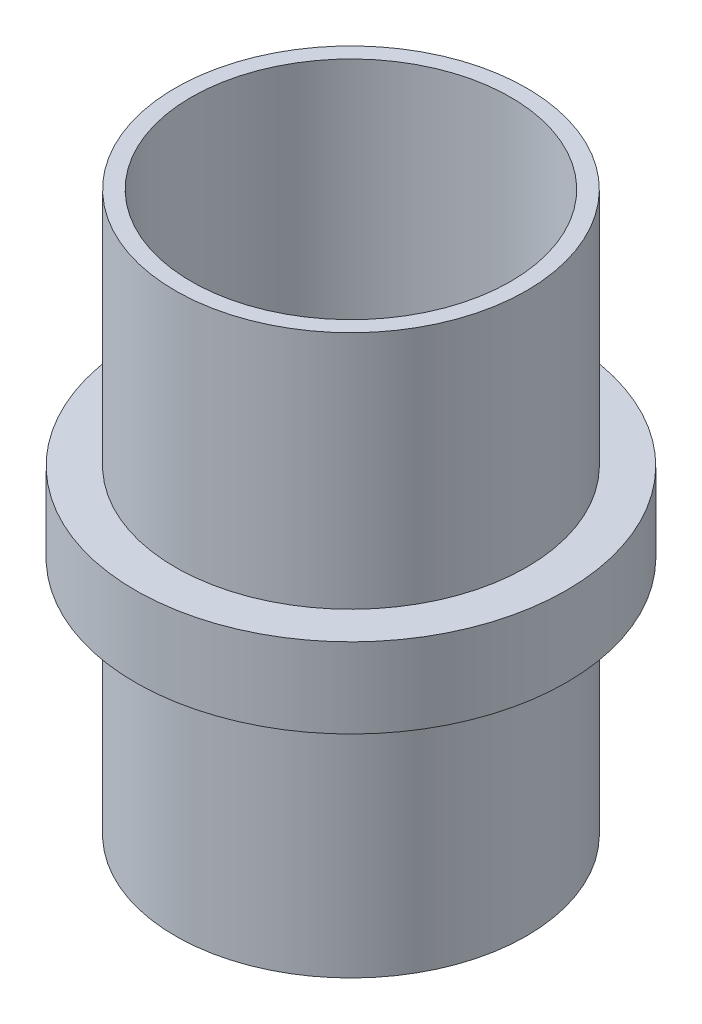
ISO-10303-21;
HEADER;
FILE_DESCRIPTION(('STEP AP214'),'2;1');
FILE_NAME('part.step','',(''),(''),'','','');
FILE_SCHEMA(('AUTOMOTIVE_DESIGN { 1 0 10303 214 1 1 1 1 }'));
ENDSEC;
DATA;
#1=APPLICATION_CONTEXT('core data for automotive mechanical design processes');
#2=APPLICATION_PROTOCOL_DEFINITION('international standard','automotive_design',2000,#1);
#3=PRODUCT_CONTEXT('',#1,'mechanical');
#4=PRODUCT('Part','Part','',(#3));
#5=PRODUCT_RELATED_PRODUCT_CATEGORY('part','',(#4));
#6=PRODUCT_DEFINITION_FORMATION('','',#4);
#7=PRODUCT_DEFINITION_CONTEXT('part definition',#1,'design');
#8=PRODUCT_DEFINITION('design','',#6,#7);
#9=PRODUCT_DEFINITION_SHAPE('','',#8);
#10=(LENGTH_UNIT() NAMED_UNIT(*) SI_UNIT(.MILLI.,.METRE.));
#11=(NAMED_UNIT(*) PLANE_ANGLE_UNIT() SI_UNIT($,.RADIAN.));
#12=(NAMED_UNIT(*) SI_UNIT($,.STERADIAN.) SOLID_ANGLE_UNIT());
#13=UNCERTAINTY_MEASURE_WITH_UNIT(LENGTH_MEASURE(1.E-05),#10,'distance_accuracy_value','');
#14=(GEOMETRIC_REPRESENTATION_CONTEXT(3) GLOBAL_UNCERTAINTY_ASSIGNED_CONTEXT((#13)) GLOBAL_UNIT_ASSIGNED_CONTEXT((#10,
#11,#12)) REPRESENTATION_CONTEXT('',''));
#15=CARTESIAN_POINT('',(0.,0.,0.));
#16=DIRECTION('',(0.,0.,1.));
#17=DIRECTION('',(1.,0.,0.));
#18=AXIS2_PLACEMENT_3D('',#15,#16,#17);
#19=CARTESIAN_POINT('',(11.,17.5,0.));
#20=DIRECTION('',(0.,1.,0.));
#21=DIRECTION('',(-1.,0.,0.));
#22=AXIS2_PLACEMENT_3D('',#19,#20,#21);
#23=PLANE('',#22);
#24=CARTESIAN_POINT('',(0.,17.5,0.));
#25=DIRECTION('',(0.,-1.,0.));
#26=DIRECTION('',(1.,0.,0.));
#27=AXIS2_PLACEMENT_3D('',#24,#25,#26);
#28=CIRCLE('',#27,10.);
#29=CARTESIAN_POINT('',(10.,17.5,0.));
#30=VERTEX_POINT('',#29);
#31=EDGE_CURVE('E10',#30,#30,#28,.T.);
#32=ORIENTED_EDGE('',*,*,#31,.T.);
#33=EDGE_LOOP('',(#32));
#34=FACE_BOUND('',#33,.T.);
#35=CARTESIAN_POINT('',(0.,17.5,0.));
#36=DIRECTION('',(0.,-1.,0.));
#37=DIRECTION('',(1.,0.,0.));
#38=AXIS2_PLACEMENT_3D('',#35,#36,#37);
#39=CIRCLE('',#38,11.);
#40=CARTESIAN_POINT('',(11.,17.5,0.));
#41=VERTEX_POINT('',#40);
#42=EDGE_CURVE('E65',#41,#41,#39,.T.);
#43=ORIENTED_EDGE('',*,*,#42,.F.);
#44=EDGE_LOOP('',(#43));
#45=FACE_BOUND('',#44,.T.);
#46=ADVANCED_FACE('F31',(#34,#45),#23,.T.);
#47=CARTESIAN_POINT('',(0.,-17.5,0.));
#48=DIRECTION('',(0.,-1.,0.));
#49=DIRECTION('',(1.,0.,0.));
#50=AXIS2_PLACEMENT_3D('',#47,#48,#49);
#51=CYLINDRICAL_SURFACE('',#50,10.);
#52=CARTESIAN_POINT('',(0.,2.5,0.));
#53=DIRECTION('',(0.,-1.,0.));
#54=DIRECTION('',(1.,0.,0.));
#55=AXIS2_PLACEMENT_3D('',#52,#53,#54);
#56=CIRCLE('',#55,10.);
#57=CARTESIAN_POINT('',(10.,2.5,0.));
#58=VERTEX_POINT('',#57);
#59=EDGE_CURVE('E37',#58,#58,#56,.T.);
#60=ORIENTED_EDGE('',*,*,#59,.T.);
#61=EDGE_LOOP('',(#60));
#62=FACE_BOUND('',#61,.T.);
#63=ORIENTED_EDGE('',*,*,#31,.F.);
#64=EDGE_LOOP('',(#63));
#65=FACE_BOUND('',#64,.T.);
#66=ADVANCED_FACE('F73',(#62,#65),#51,.F.);
#67=CARTESIAN_POINT('',(0.,2.5,0.));
#68=DIRECTION('',(0.,1.,0.));
#69=DIRECTION('',(-1.,0.,0.));
#70=AXIS2_PLACEMENT_3D('',#67,#68,#69);
#71=CONICAL_SURFACE('',#70,10.,0.197395559849881);
#72=CARTESIAN_POINT('',(0.,-2.5,0.));
#73=DIRECTION('',(0.,-1.,0.));
#74=DIRECTION('',(1.,0.,0.));
#75=AXIS2_PLACEMENT_3D('',#72,#73,#74);
#76=CIRCLE('',#75,9.);
#77=CARTESIAN_POINT('',(9.,-2.5,0.));
#78=VERTEX_POINT('',#77);
#79=EDGE_CURVE('E41',#78,#78,#76,.T.);
#80=ORIENTED_EDGE('',*,*,#79,.T.);
#81=EDGE_LOOP('',(#80));
#82=FACE_BOUND('',#81,.T.);
#83=ORIENTED_EDGE('',*,*,#59,.F.);
#84=EDGE_LOOP('',(#83));
#85=FACE_BOUND('',#84,.T.);
#86=ADVANCED_FACE('F77',(#82,#85),#71,.F.);
#87=CARTESIAN_POINT('',(0.,-17.5,0.));
#88=DIRECTION('',(0.,-1.,0.));
#89=DIRECTION('',(1.,0.,0.));
#90=AXIS2_PLACEMENT_3D('',#87,#88,#89);
#91=CYLINDRICAL_SURFACE('',#90,9.);
#92=CARTESIAN_POINT('',(0.,-17.5,0.));
#93=DIRECTION('',(0.,-1.,0.));
#94=DIRECTION('',(1.,0.,0.));
#95=AXIS2_PLACEMENT_3D('',#92,#93,#94);
#96=CIRCLE('',#95,9.);
#97=CARTESIAN_POINT('',(9.,-17.5,0.));
#98=VERTEX_POINT('',#97);
#99=EDGE_CURVE('E45',#98,#98,#96,.T.);
#100=ORIENTED_EDGE('',*,*,#99,.T.);
#101=EDGE_LOOP('',(#100));
#102=FACE_BOUND('',#101,.T.);
#103=ORIENTED_EDGE('',*,*,#79,.F.);
#104=EDGE_LOOP('',(#103));
#105=FACE_BOUND('',#104,.T.);
#106=ADVANCED_FACE('F81',(#102,#105),#91,.F.);
#107=CARTESIAN_POINT('',(11.,-17.5,0.));
#108=DIRECTION('',(0.,-1.,0.));
#109=DIRECTION('',(1.,0.,0.));
#110=AXIS2_PLACEMENT_3D('',#107,#108,#109);
#111=PLANE('',#110);
#112=CARTESIAN_POINT('',(0.,-17.5,0.));
#113=DIRECTION('',(0.,-1.,0.));
#114=DIRECTION('',(1.,0.,0.));
#115=AXIS2_PLACEMENT_3D('',#112,#113,#114);
#116=CIRCLE('',#115,11.);
#117=CARTESIAN_POINT('',(11.,-17.5,0.));
#118=VERTEX_POINT('',#117);
#119=EDGE_CURVE('E50',#118,#118,#116,.T.);
#120=ORIENTED_EDGE('',*,*,#119,.T.);
#121=EDGE_LOOP('',(#120));
#122=FACE_BOUND('',#121,.T.);
#123=ORIENTED_EDGE('',*,*,#99,.F.);
#124=EDGE_LOOP('',(#123));
#125=FACE_BOUND('',#124,.T.);
#126=ADVANCED_FACE('F88',(#122,#125),#111,.T.);
#127=CARTESIAN_POINT('',(0.,-17.5,0.));
#128=DIRECTION('',(0.,-1.,0.));
#129=DIRECTION('',(1.,0.,0.));
#130=AXIS2_PLACEMENT_3D('',#127,#128,#129);
#131=CYLINDRICAL_SURFACE('',#130,11.);
#132=CARTESIAN_POINT('',(0.,-2.5,0.));
#133=DIRECTION('',(0.,-1.,0.));
#134=DIRECTION('',(1.,0.,0.));
#135=AXIS2_PLACEMENT_3D('',#132,#133,#134);
#136=CIRCLE('',#135,11.);
#137=CARTESIAN_POINT('',(11.,-2.5,0.));
#138=VERTEX_POINT('',#137);
#139=EDGE_CURVE('E53',#138,#138,#136,.T.);
#140=ORIENTED_EDGE('',*,*,#139,.T.);
#141=EDGE_LOOP('',(#140));
#142=FACE_BOUND('',#141,.T.);
#143=ORIENTED_EDGE('',*,*,#119,.F.);
#144=EDGE_LOOP('',(#143));
#145=FACE_BOUND('',#144,.T.);
#146=ADVANCED_FACE('F92',(#142,#145),#131,.T.);
#147=CARTESIAN_POINT('',(11.,-2.5,0.));
#148=DIRECTION('',(0.,-1.,0.));
#149=DIRECTION('',(1.,0.,0.));
#150=AXIS2_PLACEMENT_3D('',#147,#148,#149);
#151=PLANE('',#150);
#152=CARTESIAN_POINT('',(0.,-2.5,0.));
#153=DIRECTION('',(0.,-1.,0.));
#154=DIRECTION('',(1.,0.,0.));
#155=AXIS2_PLACEMENT_3D('',#152,#153,#154);
#156=CIRCLE('',#155,13.5);
#157=CARTESIAN_POINT('',(13.5,-2.5,0.));
#158=VERTEX_POINT('',#157);
#159=EDGE_CURVE('E56',#158,#158,#156,.T.);
#160=ORIENTED_EDGE('',*,*,#159,.T.);
#161=EDGE_LOOP('',(#160));
#162=FACE_BOUND('',#161,.T.);
#163=ORIENTED_EDGE('',*,*,#139,.F.);
#164=EDGE_LOOP('',(#163));
#165=FACE_BOUND('',#164,.T.);
#166=ADVANCED_FACE('F96',(#162,#165),#151,.T.);
#167=CARTESIAN_POINT('',(0.,-17.5,0.));
#168=DIRECTION('',(0.,-1.,0.));
#169=DIRECTION('',(1.,0.,0.));
#170=AXIS2_PLACEMENT_3D('',#167,#168,#169);
#171=CYLINDRICAL_SURFACE('',#170,13.5);
#172=CARTESIAN_POINT('',(0.,2.5,0.));
#173=DIRECTION('',(0.,-1.,0.));
#174=DIRECTION('',(1.,0.,0.));
#175=AXIS2_PLACEMENT_3D('',#172,#173,#174);
#176=CIRCLE('',#175,13.5);
#177=CARTESIAN_POINT('',(13.5,2.5,0.));
#178=VERTEX_POINT('',#177);
#179=EDGE_CURVE('E59',#178,#178,#176,.T.);
#180=ORIENTED_EDGE('',*,*,#179,.T.);
#181=EDGE_LOOP('',(#180));
#182=FACE_BOUND('',#181,.T.);
#183=ORIENTED_EDGE('',*,*,#159,.F.);
#184=EDGE_LOOP('',(#183));
#185=FACE_BOUND('',#184,.T.);
#186=ADVANCED_FACE('F100',(#182,#185),#171,.T.);
#187=CARTESIAN_POINT('',(11.,2.5,0.));
#188=DIRECTION('',(0.,1.,0.));
#189=DIRECTION('',(-1.,0.,0.));
#190=AXIS2_PLACEMENT_3D('',#187,#188,#189);
#191=PLANE('',#190);
#192=CARTESIAN_POINT('',(0.,2.5,0.));
#193=DIRECTION('',(0.,-1.,0.));
#194=DIRECTION('',(1.,0.,0.));
#195=AXIS2_PLACEMENT_3D('',#192,#193,#194);
#196=CIRCLE('',#195,11.);
#197=CARTESIAN_POINT('',(11.,2.5,0.));
#198=VERTEX_POINT('',#197);
#199=EDGE_CURVE('E62',#198,#198,#196,.T.);
#200=ORIENTED_EDGE('',*,*,#199,.T.);
#201=EDGE_LOOP('',(#200));
#202=FACE_BOUND('',#201,.T.);
#203=ORIENTED_EDGE('',*,*,#179,.F.);
#204=EDGE_LOOP('',(#203));
#205=FACE_BOUND('',#204,.T.);
#206=ADVANCED_FACE('F104',(#202,#205),#191,.T.);
#207=CARTESIAN_POINT('',(0.,-17.5,0.));
#208=DIRECTION('',(0.,-1.,0.));
#209=DIRECTION('',(1.,0.,0.));
#210=AXIS2_PLACEMENT_3D('',#207,#208,#209);
#211=CYLINDRICAL_SURFACE('',#210,11.);
#212=ORIENTED_EDGE('',*,*,#42,.T.);
#213=EDGE_LOOP('',(#212));
#214=FACE_BOUND('',#213,.T.);
#215=ORIENTED_EDGE('',*,*,#199,.F.);
#216=EDGE_LOOP('',(#215));
#217=FACE_BOUND('',#216,.T.);
#218=ADVANCED_FACE('F69',(#214,#217),#211,.T.);
#219=CLOSED_SHELL('',(#46,#66,#86,#106,#126,#146,#166,#186,#206,#218));
#220=MANIFOLD_SOLID_BREP('B2',#219);
#221=ADVANCED_BREP_SHAPE_REPRESENTATION('',(#18,#220),#14);
#222=SHAPE_DEFINITION_REPRESENTATION(#9,#221);
ENDSEC;
END-ISO-10303-21;
